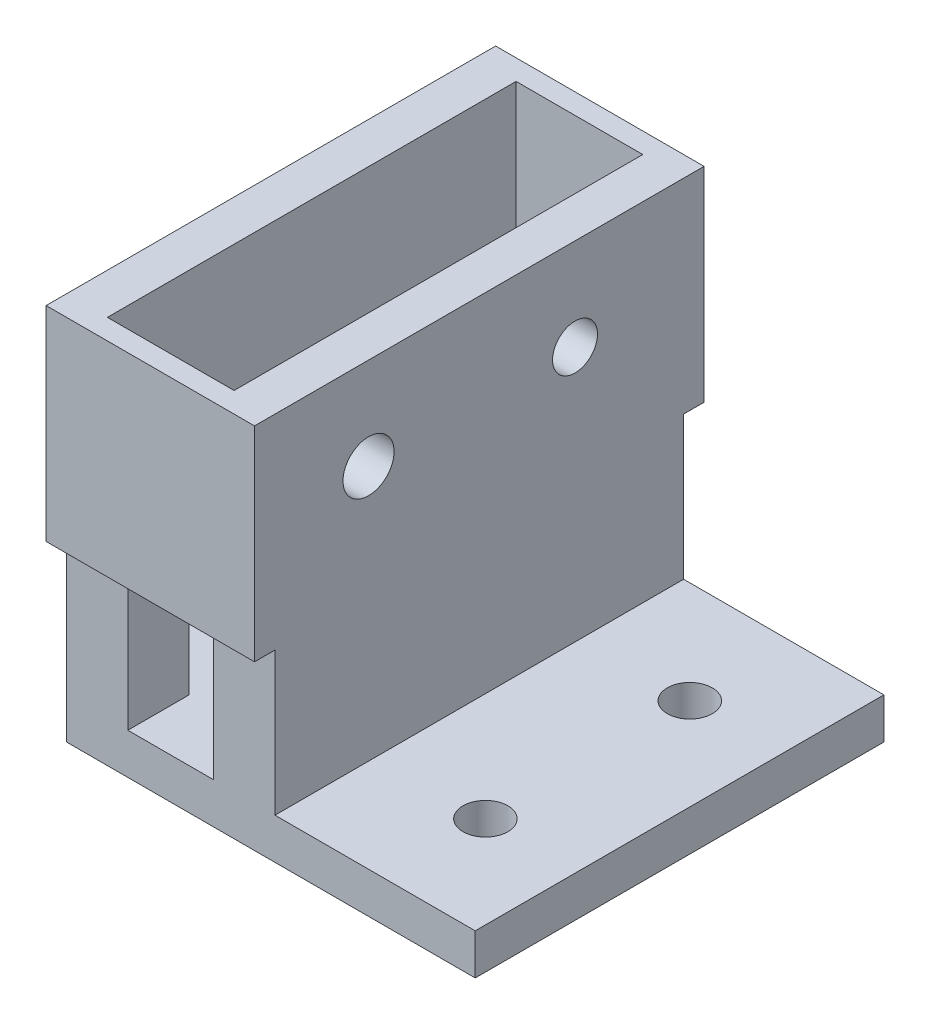
ISO-10303-21;
HEADER;
FILE_DESCRIPTION(('STEP AP214'),'2;1');
FILE_NAME('part.step','',(''),(''),'','','');
FILE_SCHEMA(('AUTOMOTIVE_DESIGN { 1 0 10303 214 1 1 1 1 }'));
ENDSEC;
DATA;
#1=APPLICATION_CONTEXT('core data for automotive mechanical design processes');
#2=APPLICATION_PROTOCOL_DEFINITION('international standard','automotive_design',2000,#1);
#3=PRODUCT_CONTEXT('',#1,'mechanical');
#4=PRODUCT('Part','Part','',(#3));
#5=PRODUCT_RELATED_PRODUCT_CATEGORY('part','',(#4));
#6=PRODUCT_DEFINITION_FORMATION('','',#4);
#7=PRODUCT_DEFINITION_CONTEXT('part definition',#1,'design');
#8=PRODUCT_DEFINITION('design','',#6,#7);
#9=PRODUCT_DEFINITION_SHAPE('','',#8);
#10=(LENGTH_UNIT() NAMED_UNIT(*) SI_UNIT(.MILLI.,.METRE.));
#11=(NAMED_UNIT(*) PLANE_ANGLE_UNIT() SI_UNIT($,.RADIAN.));
#12=(NAMED_UNIT(*) SI_UNIT($,.STERADIAN.) SOLID_ANGLE_UNIT());
#13=UNCERTAINTY_MEASURE_WITH_UNIT(LENGTH_MEASURE(1.E-05),#10,'distance_accuracy_value','');
#14=(GEOMETRIC_REPRESENTATION_CONTEXT(3) GLOBAL_UNCERTAINTY_ASSIGNED_CONTEXT((#13)) GLOBAL_UNIT_ASSIGNED_CONTEXT((#10,
#11,#12)) REPRESENTATION_CONTEXT('',''));
#15=CARTESIAN_POINT('',(0.,0.,0.));
#16=DIRECTION('',(0.,0.,1.));
#17=DIRECTION('',(1.,0.,0.));
#18=AXIS2_PLACEMENT_3D('',#15,#16,#17);
#19=CARTESIAN_POINT('',(0.,0.,0.));
#20=DIRECTION('',(0.,0.,-1.));
#21=DIRECTION('',(-1.,0.,0.));
#22=AXIS2_PLACEMENT_3D('',#19,#20,#21);
#23=PLANE('',#22);
#24=DIRECTION('',(0.,-1.,0.));
#25=VECTOR('',#24,1.);
#26=CARTESIAN_POINT('',(0.,11.,0.));
#27=LINE('',#26,#25);
#28=CARTESIAN_POINT('',(0.,0.999999999999999,0.));
#29=VERTEX_POINT('',#28);
#30=CARTESIAN_POINT('',(0.,-8.,0.));
#31=VERTEX_POINT('',#30);
#32=EDGE_CURVE('E240',#29,#31,#27,.T.);
#33=ORIENTED_EDGE('',*,*,#32,.F.);
#34=DIRECTION('',(1.,0.,0.));
#35=VECTOR('',#34,1.);
#36=CARTESIAN_POINT('',(0.,0.999999999999999,0.));
#37=LINE('',#36,#35);
#38=CARTESIAN_POINT('',(3.,0.999999999999999,0.));
#39=VERTEX_POINT('',#38);
#40=EDGE_CURVE('E319',#29,#39,#37,.T.);
#41=ORIENTED_EDGE('',*,*,#40,.T.);
#42=DIRECTION('',(0.,1.,0.));
#43=VECTOR('',#42,1.);
#44=CARTESIAN_POINT('',(3.,2.,0.));
#45=LINE('',#44,#43);
#46=CARTESIAN_POINT('',(3.,-6.,0.));
#47=VERTEX_POINT('',#46);
#48=EDGE_CURVE('E265',#47,#39,#45,.T.);
#49=ORIENTED_EDGE('',*,*,#48,.F.);
#50=DIRECTION('',(-1.,0.,0.));
#51=VECTOR('',#50,1.);
#52=CARTESIAN_POINT('',(3.,-6.,0.));
#53=LINE('',#52,#51);
#54=CARTESIAN_POINT('',(7.2,-6.,0.));
#55=VERTEX_POINT('',#54);
#56=EDGE_CURVE('E261',#55,#47,#53,.T.);
#57=ORIENTED_EDGE('',*,*,#56,.F.);
#58=DIRECTION('',(0.,-1.,0.));
#59=VECTOR('',#58,1.);
#60=CARTESIAN_POINT('',(7.2,-6.,0.));
#61=LINE('',#60,#59);
#62=CARTESIAN_POINT('',(7.2,0.999999999999999,0.));
#63=VERTEX_POINT('',#62);
#64=EDGE_CURVE('E257',#63,#55,#61,.T.);
#65=ORIENTED_EDGE('',*,*,#64,.F.);
#66=CARTESIAN_POINT('',(10.2,0.999999999999999,0.));
#67=VERTEX_POINT('',#66);
#68=EDGE_CURVE('E43',#63,#67,#37,.T.);
#69=ORIENTED_EDGE('',*,*,#68,.T.);
#70=DIRECTION('',(0.,1.,0.));
#71=VECTOR('',#70,1.);
#72=CARTESIAN_POINT('',(10.2,11.,0.));
#73=LINE('',#72,#71);
#74=CARTESIAN_POINT('',(10.2,-6.,0.));
#75=VERTEX_POINT('',#74);
#76=EDGE_CURVE('E249',#75,#67,#73,.T.);
#77=ORIENTED_EDGE('',*,*,#76,.F.);
#78=DIRECTION('',(-1.,0.,0.));
#79=VECTOR('',#78,1.);
#80=CARTESIAN_POINT('',(10.2,-6.,0.));
#81=LINE('',#80,#79);
#82=CARTESIAN_POINT('',(20.,-6.,0.));
#83=VERTEX_POINT('',#82);
#84=EDGE_CURVE('E247',#83,#75,#81,.T.);
#85=ORIENTED_EDGE('',*,*,#84,.F.);
#86=DIRECTION('',(0.,1.,0.));
#87=VECTOR('',#86,1.);
#88=CARTESIAN_POINT('',(20.,-8.,0.));
#89=LINE('',#88,#87);
#90=CARTESIAN_POINT('',(20.,-8.,0.));
#91=VERTEX_POINT('',#90);
#92=EDGE_CURVE('E245',#91,#83,#89,.T.);
#93=ORIENTED_EDGE('',*,*,#92,.F.);
#94=DIRECTION('',(1.,0.,0.));
#95=VECTOR('',#94,1.);
#96=CARTESIAN_POINT('',(0.,-8.,0.));
#97=LINE('',#96,#95);
#98=EDGE_CURVE('E242',#31,#91,#97,.T.);
#99=ORIENTED_EDGE('',*,*,#98,.F.);
#100=EDGE_LOOP('',(#33,#41,#49,#57,#65,#69,#77,#85,#93,#99));
#101=FACE_BOUND('',#100,.T.);
#102=ADVANCED_FACE('F34',(#101),#23,.T.);
#103=CARTESIAN_POINT('',(0.,11.,20.));
#104=DIRECTION('',(1.,0.,0.));
#105=DIRECTION('',(0.,1.,0.));
#106=AXIS2_PLACEMENT_3D('',#103,#104,#105);
#107=PLANE('',#106);
#108=DIRECTION('',(0.,0.,1.));
#109=VECTOR('',#108,1.);
#110=CARTESIAN_POINT('',(0.,-6.,3.));
#111=LINE('',#110,#109);
#112=CARTESIAN_POINT('',(0.,-6.,3.));
#113=VERTEX_POINT('',#112);
#114=CARTESIAN_POINT('',(0.,-6.,17.));
#115=VERTEX_POINT('',#114);
#116=EDGE_CURVE('E404',#113,#115,#111,.T.);
#117=ORIENTED_EDGE('',*,*,#116,.F.);
#118=DIRECTION('',(0.,-1.,0.));
#119=VECTOR('',#118,1.);
#120=CARTESIAN_POINT('',(0.,-6.,3.));
#121=LINE('',#120,#119);
#122=CARTESIAN_POINT('',(0.,-2.,3.));
#123=VERTEX_POINT('',#122);
#124=EDGE_CURVE('E395',#123,#113,#121,.T.);
#125=ORIENTED_EDGE('',*,*,#124,.F.);
#126=DIRECTION('',(0.,0.,-1.));
#127=VECTOR('',#126,1.);
#128=CARTESIAN_POINT('',(0.,-2.,3.));
#129=LINE('',#128,#127);
#130=CARTESIAN_POINT('',(0.,-2.,17.));
#131=VERTEX_POINT('',#130);
#132=EDGE_CURVE('E410',#131,#123,#129,.T.);
#133=ORIENTED_EDGE('',*,*,#132,.F.);
#134=DIRECTION('',(0.,1.,0.));
#135=VECTOR('',#134,1.);
#136=CARTESIAN_POINT('',(0.,-6.,17.));
#137=LINE('',#136,#135);
#138=EDGE_CURVE('E407',#115,#131,#137,.T.);
#139=ORIENTED_EDGE('',*,*,#138,.F.);
#140=EDGE_LOOP('',(#117,#125,#133,#139));
#141=FACE_BOUND('',#140,.T.);
#142=DIRECTION('',(0.,0.,-1.));
#143=VECTOR('',#142,1.);
#144=CARTESIAN_POINT('',(0.,11.,20.));
#145=LINE('',#144,#143);
#146=CARTESIAN_POINT('',(0.,11.,21.));
#147=VERTEX_POINT('',#146);
#148=CARTESIAN_POINT('',(0.,11.,-1.));
#149=VERTEX_POINT('',#148);
#150=EDGE_CURVE('E38',#147,#149,#145,.T.);
#151=ORIENTED_EDGE('',*,*,#150,.T.);
#152=DIRECTION('',(0.,1.,0.));
#153=VECTOR('',#152,1.);
#154=CARTESIAN_POINT('',(0.,0.999999999999999,-1.));
#155=LINE('',#154,#153);
#156=CARTESIAN_POINT('',(0.,0.999999999999999,-1.));
#157=VERTEX_POINT('',#156);
#158=EDGE_CURVE('E364',#157,#149,#155,.T.);
#159=ORIENTED_EDGE('',*,*,#158,.F.);
#160=DIRECTION('',(0.,0.,1.));
#161=VECTOR('',#160,1.);
#162=CARTESIAN_POINT('',(0.,0.999999999999999,-1.));
#163=LINE('',#162,#161);
#164=EDGE_CURVE('E329',#157,#29,#163,.T.);
#165=ORIENTED_EDGE('',*,*,#164,.T.);
#166=ORIENTED_EDGE('',*,*,#32,.T.);
#167=DIRECTION('',(0.,0.,-1.));
#168=VECTOR('',#167,1.);
#169=CARTESIAN_POINT('',(0.,-8.,20.));
#170=LINE('',#169,#168);
#171=CARTESIAN_POINT('',(0.,-8.,20.));
#172=VERTEX_POINT('',#171);
#173=EDGE_CURVE('E308',#172,#31,#170,.T.);
#174=ORIENTED_EDGE('',*,*,#173,.F.);
#175=DIRECTION('',(0.,-1.,0.));
#176=VECTOR('',#175,1.);
#177=CARTESIAN_POINT('',(0.,11.,20.));
#178=LINE('',#177,#176);
#179=CARTESIAN_POINT('',(0.,0.999999999999999,20.));
#180=VERTEX_POINT('',#179);
#181=EDGE_CURVE('E274',#180,#172,#178,.T.);
#182=ORIENTED_EDGE('',*,*,#181,.F.);
#183=DIRECTION('',(0.,0.,1.));
#184=VECTOR('',#183,1.);
#185=CARTESIAN_POINT('',(0.,0.999999999999999,20.));
#186=LINE('',#185,#184);
#187=CARTESIAN_POINT('',(0.,0.999999999999999,21.));
#188=VERTEX_POINT('',#187);
#189=EDGE_CURVE('E58',#180,#188,#186,.T.);
#190=ORIENTED_EDGE('',*,*,#189,.T.);
#191=DIRECTION('',(0.,1.,0.));
#192=VECTOR('',#191,1.);
#193=CARTESIAN_POINT('',(0.,0.999999999999999,21.));
#194=LINE('',#193,#192);
#195=EDGE_CURVE('E340',#188,#147,#194,.T.);
#196=ORIENTED_EDGE('',*,*,#195,.T.);
#197=EDGE_LOOP('',(#151,#159,#165,#166,#174,#182,#190,#196));
#198=FACE_BOUND('',#197,.T.);
#199=ADVANCED_FACE('F36',(#141,#198),#107,.F.);
#200=CARTESIAN_POINT('',(0.,-8.,20.));
#201=DIRECTION('',(0.,1.,0.));
#202=DIRECTION('',(0.,0.,1.));
#203=AXIS2_PLACEMENT_3D('',#200,#201,#202);
#204=PLANE('',#203);
#205=CARTESIAN_POINT('',(15.5,-8.,15.));
#206=DIRECTION('',(0.,1.,0.));
#207=DIRECTION('',(0.,0.,1.));
#208=AXIS2_PLACEMENT_3D('',#205,#206,#207);
#209=CIRCLE('',#208,1.1);
#210=CARTESIAN_POINT('',(15.5,-8.,16.1));
#211=VERTEX_POINT('',#210);
#212=EDGE_CURVE('E386',#211,#211,#209,.T.);
#213=ORIENTED_EDGE('',*,*,#212,.T.);
#214=EDGE_LOOP('',(#213));
#215=FACE_BOUND('',#214,.T.);
#216=CARTESIAN_POINT('',(15.5,-8.,5.));
#217=DIRECTION('',(0.,1.,0.));
#218=DIRECTION('',(0.,0.,1.));
#219=AXIS2_PLACEMENT_3D('',#216,#217,#218);
#220=CIRCLE('',#219,1.1);
#221=CARTESIAN_POINT('',(15.5,-8.,6.1));
#222=VERTEX_POINT('',#221);
#223=EDGE_CURVE('E392',#222,#222,#220,.T.);
#224=ORIENTED_EDGE('',*,*,#223,.T.);
#225=EDGE_LOOP('',(#224));
#226=FACE_BOUND('',#225,.T.);
#227=ORIENTED_EDGE('',*,*,#98,.T.);
#228=DIRECTION('',(0.,0.,-1.));
#229=VECTOR('',#228,1.);
#230=CARTESIAN_POINT('',(20.,-8.,20.));
#231=LINE('',#230,#229);
#232=CARTESIAN_POINT('',(20.,-8.,20.));
#233=VERTEX_POINT('',#232);
#234=EDGE_CURVE('E306',#233,#91,#231,.T.);
#235=ORIENTED_EDGE('',*,*,#234,.F.);
#236=DIRECTION('',(1.,0.,0.));
#237=VECTOR('',#236,1.);
#238=CARTESIAN_POINT('',(0.,-8.,20.));
#239=LINE('',#238,#237);
#240=EDGE_CURVE('E422',#172,#233,#239,.T.);
#241=ORIENTED_EDGE('',*,*,#240,.F.);
#242=ORIENTED_EDGE('',*,*,#173,.T.);
#243=EDGE_LOOP('',(#227,#235,#241,#242));
#244=FACE_BOUND('',#243,.T.);
#245=ADVANCED_FACE('F432',(#215,#226,#244),#204,.F.);
#246=CARTESIAN_POINT('',(20.,-8.,20.));
#247=DIRECTION('',(-1.,0.,0.));
#248=DIRECTION('',(0.,0.,1.));
#249=AXIS2_PLACEMENT_3D('',#246,#247,#248);
#250=PLANE('',#249);
#251=ORIENTED_EDGE('',*,*,#92,.T.);
#252=DIRECTION('',(0.,0.,-1.));
#253=VECTOR('',#252,1.);
#254=CARTESIAN_POINT('',(20.,-6.,20.));
#255=LINE('',#254,#253);
#256=CARTESIAN_POINT('',(20.,-6.,20.));
#257=VERTEX_POINT('',#256);
#258=EDGE_CURVE('E303',#257,#83,#255,.T.);
#259=ORIENTED_EDGE('',*,*,#258,.F.);
#260=DIRECTION('',(0.,1.,0.));
#261=VECTOR('',#260,1.);
#262=CARTESIAN_POINT('',(20.,-8.,20.));
#263=LINE('',#262,#261);
#264=EDGE_CURVE('E221',#233,#257,#263,.T.);
#265=ORIENTED_EDGE('',*,*,#264,.F.);
#266=ORIENTED_EDGE('',*,*,#234,.T.);
#267=EDGE_LOOP('',(#251,#259,#265,#266));
#268=FACE_BOUND('',#267,.T.);
#269=ADVANCED_FACE('F427',(#268),#250,.F.);
#270=CARTESIAN_POINT('',(10.2,-6.,20.));
#271=DIRECTION('',(0.,-1.,0.));
#272=DIRECTION('',(0.,0.,-1.));
#273=AXIS2_PLACEMENT_3D('',#270,#271,#272);
#274=PLANE('',#273);
#275=CARTESIAN_POINT('',(15.5,-6.,15.));
#276=DIRECTION('',(0.,1.,0.));
#277=DIRECTION('',(0.,0.,1.));
#278=AXIS2_PLACEMENT_3D('',#275,#276,#277);
#279=CIRCLE('',#278,1.1);
#280=CARTESIAN_POINT('',(15.5,-6.,16.1));
#281=VERTEX_POINT('',#280);
#282=EDGE_CURVE('E383',#281,#281,#279,.T.);
#283=ORIENTED_EDGE('',*,*,#282,.F.);
#284=EDGE_LOOP('',(#283));
#285=FACE_BOUND('',#284,.T.);
#286=CARTESIAN_POINT('',(15.5,-6.,5.));
#287=DIRECTION('',(0.,1.,0.));
#288=DIRECTION('',(0.,0.,1.));
#289=AXIS2_PLACEMENT_3D('',#286,#287,#288);
#290=CIRCLE('',#289,1.1);
#291=CARTESIAN_POINT('',(15.5,-6.,6.1));
#292=VERTEX_POINT('',#291);
#293=EDGE_CURVE('E389',#292,#292,#290,.T.);
#294=ORIENTED_EDGE('',*,*,#293,.F.);
#295=EDGE_LOOP('',(#294));
#296=FACE_BOUND('',#295,.T.);
#297=ORIENTED_EDGE('',*,*,#84,.T.);
#298=DIRECTION('',(0.,0.,-1.));
#299=VECTOR('',#298,1.);
#300=CARTESIAN_POINT('',(10.2,-6.,20.));
#301=LINE('',#300,#299);
#302=CARTESIAN_POINT('',(10.2,-6.,20.));
#303=VERTEX_POINT('',#302);
#304=EDGE_CURVE('E301',#303,#75,#301,.T.);
#305=ORIENTED_EDGE('',*,*,#304,.F.);
#306=DIRECTION('',(-1.,0.,0.));
#307=VECTOR('',#306,1.);
#308=CARTESIAN_POINT('',(10.2,-6.,20.));
#309=LINE('',#308,#307);
#310=EDGE_CURVE('E215',#257,#303,#309,.T.);
#311=ORIENTED_EDGE('',*,*,#310,.F.);
#312=ORIENTED_EDGE('',*,*,#258,.T.);
#313=EDGE_LOOP('',(#297,#305,#311,#312));
#314=FACE_BOUND('',#313,.T.);
#315=ADVANCED_FACE('F431',(#285,#296,#314),#274,.F.);
#316=CARTESIAN_POINT('',(10.2,11.,20.));
#317=DIRECTION('',(-1.,0.,0.));
#318=DIRECTION('',(0.,-1.,0.));
#319=AXIS2_PLACEMENT_3D('',#316,#317,#318);
#320=PLANE('',#319);
#321=CARTESIAN_POINT('',(10.2,6.5,5.31577710767275));
#322=DIRECTION('',(1.,0.,0.));
#323=DIRECTION('',(0.,0.,-1.));
#324=AXIS2_PLACEMENT_3D('',#321,#322,#323);
#325=CIRCLE('',#324,1.1);
#326=CARTESIAN_POINT('',(10.2,6.5,4.21577710767275));
#327=VERTEX_POINT('',#326);
#328=EDGE_CURVE('E367',#327,#327,#325,.T.);
#329=ORIENTED_EDGE('',*,*,#328,.F.);
#330=EDGE_LOOP('',(#329));
#331=FACE_BOUND('',#330,.T.);
#332=CARTESIAN_POINT('',(10.2,6.5,15.4211545187749));
#333=DIRECTION('',(1.,0.,0.));
#334=DIRECTION('',(0.,0.,-1.));
#335=AXIS2_PLACEMENT_3D('',#332,#333,#334);
#336=CIRCLE('',#335,1.25);
#337=CARTESIAN_POINT('',(10.2,6.5,14.1711545187749));
#338=VERTEX_POINT('',#337);
#339=EDGE_CURVE('E377',#338,#338,#336,.T.);
#340=ORIENTED_EDGE('',*,*,#339,.F.);
#341=EDGE_LOOP('',(#340));
#342=FACE_BOUND('',#341,.T.);
#343=ORIENTED_EDGE('',*,*,#76,.T.);
#344=DIRECTION('',(0.,0.,-1.));
#345=VECTOR('',#344,1.);
#346=CARTESIAN_POINT('',(10.2,0.999999999999999,0.));
#347=LINE('',#346,#345);
#348=CARTESIAN_POINT('',(10.2,0.999999999999999,-1.));
#349=VERTEX_POINT('',#348);
#350=EDGE_CURVE('E327',#67,#349,#347,.T.);
#351=ORIENTED_EDGE('',*,*,#350,.T.);
#352=DIRECTION('',(0.,1.,0.));
#353=VECTOR('',#352,1.);
#354=CARTESIAN_POINT('',(10.2,0.999999999999999,-1.));
#355=LINE('',#354,#353);
#356=CARTESIAN_POINT('',(10.2,11.,-1.));
#357=VERTEX_POINT('',#356);
#358=EDGE_CURVE('E362',#349,#357,#355,.T.);
#359=ORIENTED_EDGE('',*,*,#358,.T.);
#360=DIRECTION('',(0.,0.,-1.));
#361=VECTOR('',#360,1.);
#362=CARTESIAN_POINT('',(10.2,11.,20.));
#363=LINE('',#362,#361);
#364=CARTESIAN_POINT('',(10.2,11.,21.));
#365=VERTEX_POINT('',#364);
#366=EDGE_CURVE('E299',#365,#357,#363,.T.);
#367=ORIENTED_EDGE('',*,*,#366,.F.);
#368=DIRECTION('',(0.,1.,0.));
#369=VECTOR('',#368,1.);
#370=CARTESIAN_POINT('',(10.2,0.999999999999999,21.));
#371=LINE('',#370,#369);
#372=CARTESIAN_POINT('',(10.2,0.999999999999999,21.));
#373=VERTEX_POINT('',#372);
#374=EDGE_CURVE('E210',#373,#365,#371,.T.);
#375=ORIENTED_EDGE('',*,*,#374,.F.);
#376=DIRECTION('',(0.,0.,-1.));
#377=VECTOR('',#376,1.);
#378=CARTESIAN_POINT('',(10.2,0.999999999999999,21.));
#379=LINE('',#378,#377);
#380=CARTESIAN_POINT('',(10.2,0.999999999999999,20.));
#381=VERTEX_POINT('',#380);
#382=EDGE_CURVE('E198',#373,#381,#379,.T.);
#383=ORIENTED_EDGE('',*,*,#382,.T.);
#384=DIRECTION('',(0.,1.,0.));
#385=VECTOR('',#384,1.);
#386=CARTESIAN_POINT('',(10.2,11.,20.));
#387=LINE('',#386,#385);
#388=EDGE_CURVE('E208',#303,#381,#387,.T.);
#389=ORIENTED_EDGE('',*,*,#388,.F.);
#390=ORIENTED_EDGE('',*,*,#304,.T.);
#391=EDGE_LOOP('',(#343,#351,#359,#367,#375,#383,#389,#390));
#392=FACE_BOUND('',#391,.T.);
#393=ADVANCED_FACE('F206',(#331,#342,#392),#320,.F.);
#394=CARTESIAN_POINT('',(8.2,11.,20.));
#395=DIRECTION('',(0.,-1.,0.));
#396=DIRECTION('',(0.,0.,-1.));
#397=AXIS2_PLACEMENT_3D('',#394,#395,#396);
#398=PLANE('',#397);
#399=ORIENTED_EDGE('',*,*,#150,.F.);
#400=DIRECTION('',(1.,0.,0.));
#401=VECTOR('',#400,1.);
#402=CARTESIAN_POINT('',(0.,11.,21.));
#403=LINE('',#402,#401);
#404=EDGE_CURVE('E211',#147,#365,#403,.T.);
#405=ORIENTED_EDGE('',*,*,#404,.T.);
#406=ORIENTED_EDGE('',*,*,#366,.T.);
#407=DIRECTION('',(-1.,0.,0.));
#408=VECTOR('',#407,1.);
#409=CARTESIAN_POINT('',(10.2,11.,-1.));
#410=LINE('',#409,#408);
#411=EDGE_CURVE('E333',#357,#149,#410,.T.);
#412=ORIENTED_EDGE('',*,*,#411,.T.);
#413=EDGE_LOOP('',(#399,#405,#406,#412));
#414=FACE_BOUND('',#413,.T.);
#415=DIRECTION('',(-1.,0.,0.));
#416=VECTOR('',#415,1.);
#417=CARTESIAN_POINT('',(10.2,11.,20.));
#418=LINE('',#417,#416);
#419=CARTESIAN_POINT('',(8.2,11.,20.));
#420=VERTEX_POINT('',#419);
#421=CARTESIAN_POINT('',(2.,11.,20.));
#422=VERTEX_POINT('',#421);
#423=EDGE_CURVE('E346',#420,#422,#418,.T.);
#424=ORIENTED_EDGE('',*,*,#423,.T.);
#425=DIRECTION('',(0.,0.,-1.));
#426=VECTOR('',#425,1.);
#427=CARTESIAN_POINT('',(2.,11.,20.));
#428=LINE('',#427,#426);
#429=CARTESIAN_POINT('',(2.,11.,0.));
#430=VERTEX_POINT('',#429);
#431=EDGE_CURVE('E239',#422,#430,#428,.T.);
#432=ORIENTED_EDGE('',*,*,#431,.T.);
#433=DIRECTION('',(1.,0.,0.));
#434=VECTOR('',#433,1.);
#435=CARTESIAN_POINT('',(0.,11.,0.));
#436=LINE('',#435,#434);
#437=CARTESIAN_POINT('',(8.2,11.,0.));
#438=VERTEX_POINT('',#437);
#439=EDGE_CURVE('E337',#430,#438,#436,.T.);
#440=ORIENTED_EDGE('',*,*,#439,.T.);
#441=DIRECTION('',(0.,0.,-1.));
#442=VECTOR('',#441,1.);
#443=CARTESIAN_POINT('',(8.2,11.,20.));
#444=LINE('',#443,#442);
#445=EDGE_CURVE('E296',#420,#438,#444,.T.);
#446=ORIENTED_EDGE('',*,*,#445,.F.);
#447=EDGE_LOOP('',(#424,#432,#440,#446));
#448=FACE_BOUND('',#447,.T.);
#449=ADVANCED_FACE('F355',(#414,#448),#398,.F.);
#450=CARTESIAN_POINT('',(8.2,2.,20.));
#451=DIRECTION('',(1.,0.,0.));
#452=DIRECTION('',(0.,0.,-1.));
#453=AXIS2_PLACEMENT_3D('',#450,#451,#452);
#454=PLANE('',#453);
#455=CARTESIAN_POINT('',(8.2,6.5,5.31577710767275));
#456=DIRECTION('',(1.,0.,0.));
#457=DIRECTION('',(0.,0.,-1.));
#458=AXIS2_PLACEMENT_3D('',#455,#456,#457);
#459=CIRCLE('',#458,1.1);
#460=CARTESIAN_POINT('',(8.2,6.5,4.21577710767275));
#461=VERTEX_POINT('',#460);
#462=EDGE_CURVE('E370',#461,#461,#459,.F.);
#463=ORIENTED_EDGE('',*,*,#462,.F.);
#464=EDGE_LOOP('',(#463));
#465=FACE_BOUND('',#464,.T.);
#466=CARTESIAN_POINT('',(8.2,6.5,15.4211545187749));
#467=DIRECTION('',(1.,0.,0.));
#468=DIRECTION('',(0.,0.,-1.));
#469=AXIS2_PLACEMENT_3D('',#466,#467,#468);
#470=CIRCLE('',#469,1.25);
#471=CARTESIAN_POINT('',(8.2,6.5,14.1711545187749));
#472=VERTEX_POINT('',#471);
#473=EDGE_CURVE('E380',#472,#472,#470,.F.);
#474=ORIENTED_EDGE('',*,*,#473,.F.);
#475=EDGE_LOOP('',(#474));
#476=FACE_BOUND('',#475,.T.);
#477=DIRECTION('',(0.,-1.,0.));
#478=VECTOR('',#477,1.);
#479=CARTESIAN_POINT('',(8.2,2.,0.));
#480=LINE('',#479,#478);
#481=CARTESIAN_POINT('',(8.2,2.,0.));
#482=VERTEX_POINT('',#481);
#483=EDGE_CURVE('E251',#438,#482,#480,.T.);
#484=ORIENTED_EDGE('',*,*,#483,.T.);
#485=DIRECTION('',(0.,0.,-1.));
#486=VECTOR('',#485,1.);
#487=CARTESIAN_POINT('',(8.2,2.,20.));
#488=LINE('',#487,#486);
#489=CARTESIAN_POINT('',(8.2,2.,20.));
#490=VERTEX_POINT('',#489);
#491=EDGE_CURVE('E293',#490,#482,#488,.T.);
#492=ORIENTED_EDGE('',*,*,#491,.F.);
#493=DIRECTION('',(0.,-1.,0.));
#494=VECTOR('',#493,1.);
#495=CARTESIAN_POINT('',(8.2,2.,20.));
#496=LINE('',#495,#494);
#497=EDGE_CURVE('E217',#420,#490,#496,.T.);
#498=ORIENTED_EDGE('',*,*,#497,.F.);
#499=ORIENTED_EDGE('',*,*,#445,.T.);
#500=EDGE_LOOP('',(#484,#492,#498,#499));
#501=FACE_BOUND('',#500,.T.);
#502=ADVANCED_FACE('F472',(#465,#476,#501),#454,.F.);
#503=CARTESIAN_POINT('',(7.2,2.,20.));
#504=DIRECTION('',(0.,-1.,0.));
#505=DIRECTION('',(0.,0.,-1.));
#506=AXIS2_PLACEMENT_3D('',#503,#504,#505);
#507=PLANE('',#506);
#508=DIRECTION('',(-1.,0.,0.));
#509=VECTOR('',#508,1.);
#510=CARTESIAN_POINT('',(7.2,2.,0.));
#511=LINE('',#510,#509);
#512=CARTESIAN_POINT('',(7.2,2.,0.));
#513=VERTEX_POINT('',#512);
#514=EDGE_CURVE('E254',#482,#513,#511,.T.);
#515=ORIENTED_EDGE('',*,*,#514,.T.);
#516=DIRECTION('',(0.,0.,-1.));
#517=VECTOR('',#516,1.);
#518=CARTESIAN_POINT('',(7.2,2.,20.));
#519=LINE('',#518,#517);
#520=CARTESIAN_POINT('',(7.2,2.,20.));
#521=VERTEX_POINT('',#520);
#522=EDGE_CURVE('E290',#521,#513,#519,.T.);
#523=ORIENTED_EDGE('',*,*,#522,.F.);
#524=DIRECTION('',(-1.,0.,0.));
#525=VECTOR('',#524,1.);
#526=CARTESIAN_POINT('',(7.2,2.,20.));
#527=LINE('',#526,#525);
#528=EDGE_CURVE('E219',#490,#521,#527,.T.);
#529=ORIENTED_EDGE('',*,*,#528,.F.);
#530=ORIENTED_EDGE('',*,*,#491,.T.);
#531=EDGE_LOOP('',(#515,#523,#529,#530));
#532=FACE_BOUND('',#531,.T.);
#533=ADVANCED_FACE('F468',(#532),#507,.F.);
#534=CARTESIAN_POINT('',(7.2,-6.,20.));
#535=DIRECTION('',(1.,0.,0.));
#536=DIRECTION('',(0.,0.,-1.));
#537=AXIS2_PLACEMENT_3D('',#534,#535,#536);
#538=PLANE('',#537);
#539=EDGE_CURVE('E258',#513,#63,#61,.T.);
#540=ORIENTED_EDGE('',*,*,#539,.T.);
#541=ORIENTED_EDGE('',*,*,#64,.T.);
#542=DIRECTION('',(0.,0.,-1.));
#543=VECTOR('',#542,1.);
#544=CARTESIAN_POINT('',(7.2,-6.,20.));
#545=LINE('',#544,#543);
#546=CARTESIAN_POINT('',(7.2,-6.,20.));
#547=VERTEX_POINT('',#546);
#548=EDGE_CURVE('E287',#547,#55,#545,.T.);
#549=ORIENTED_EDGE('',*,*,#548,.F.);
#550=DIRECTION('',(0.,-1.,0.));
#551=VECTOR('',#550,1.);
#552=CARTESIAN_POINT('',(7.2,-6.,20.));
#553=LINE('',#552,#551);
#554=CARTESIAN_POINT('',(7.2,0.999999999999999,20.));
#555=VERTEX_POINT('',#554);
#556=EDGE_CURVE('E226',#555,#547,#553,.T.);
#557=ORIENTED_EDGE('',*,*,#556,.F.);
#558=EDGE_CURVE('E227',#521,#555,#553,.T.);
#559=ORIENTED_EDGE('',*,*,#558,.F.);
#560=ORIENTED_EDGE('',*,*,#522,.T.);
#561=EDGE_LOOP('',(#540,#541,#549,#557,#559,#560));
#562=FACE_BOUND('',#561,.T.);
#563=ADVANCED_FACE('F464',(#562),#538,.F.);
#564=CARTESIAN_POINT('',(3.,-6.,20.));
#565=DIRECTION('',(0.,-1.,0.));
#566=DIRECTION('',(0.,0.,-1.));
#567=AXIS2_PLACEMENT_3D('',#564,#565,#566);
#568=PLANE('',#567);
#569=ORIENTED_EDGE('',*,*,#56,.T.);
#570=DIRECTION('',(0.,0.,-1.));
#571=VECTOR('',#570,1.);
#572=CARTESIAN_POINT('',(3.,-6.,20.));
#573=LINE('',#572,#571);
#574=CARTESIAN_POINT('',(3.,-6.,3.));
#575=VERTEX_POINT('',#574);
#576=EDGE_CURVE('E283',#575,#47,#573,.T.);
#577=ORIENTED_EDGE('',*,*,#576,.F.);
#578=DIRECTION('',(-1.,0.,0.));
#579=VECTOR('',#578,1.);
#580=CARTESIAN_POINT('',(17.560219778561,-6.,3.));
#581=LINE('',#580,#579);
#582=EDGE_CURVE('E413',#575,#113,#581,.T.);
#583=ORIENTED_EDGE('',*,*,#582,.T.);
#584=ORIENTED_EDGE('',*,*,#116,.T.);
#585=DIRECTION('',(-1.,0.,0.));
#586=VECTOR('',#585,1.);
#587=CARTESIAN_POINT('',(17.560219778561,-6.,17.));
#588=LINE('',#587,#586);
#589=CARTESIAN_POINT('',(3.,-6.,17.));
#590=VERTEX_POINT('',#589);
#591=EDGE_CURVE('E417',#590,#115,#588,.T.);
#592=ORIENTED_EDGE('',*,*,#591,.F.);
#593=CARTESIAN_POINT('',(3.,-6.,20.));
#594=VERTEX_POINT('',#593);
#595=EDGE_CURVE('E284',#594,#590,#573,.T.);
#596=ORIENTED_EDGE('',*,*,#595,.F.);
#597=DIRECTION('',(-1.,0.,0.));
#598=VECTOR('',#597,1.);
#599=CARTESIAN_POINT('',(3.,-6.,20.));
#600=LINE('',#599,#598);
#601=EDGE_CURVE('E229',#547,#594,#600,.T.);
#602=ORIENTED_EDGE('',*,*,#601,.F.);
#603=ORIENTED_EDGE('',*,*,#548,.T.);
#604=EDGE_LOOP('',(#569,#577,#583,#584,#592,#596,#602,#603));
#605=FACE_BOUND('',#604,.T.);
#606=ADVANCED_FACE('F460',(#605),#568,.F.);
#607=CARTESIAN_POINT('',(3.,2.,20.));
#608=DIRECTION('',(-1.,0.,0.));
#609=DIRECTION('',(0.,0.,1.));
#610=AXIS2_PLACEMENT_3D('',#607,#608,#609);
#611=PLANE('',#610);
#612=DIRECTION('',(0.,0.,1.));
#613=VECTOR('',#612,1.);
#614=CARTESIAN_POINT('',(3.,-2.,3.));
#615=LINE('',#614,#613);
#616=CARTESIAN_POINT('',(3.,-2.,3.));
#617=VERTEX_POINT('',#616);
#618=CARTESIAN_POINT('',(3.,-2.,17.));
#619=VERTEX_POINT('',#618);
#620=EDGE_CURVE('E399',#617,#619,#615,.T.);
#621=ORIENTED_EDGE('',*,*,#620,.F.);
#622=DIRECTION('',(0.,1.,0.));
#623=VECTOR('',#622,1.);
#624=CARTESIAN_POINT('',(3.,-6.,3.));
#625=LINE('',#624,#623);
#626=EDGE_CURVE('E243',#575,#617,#625,.T.);
#627=ORIENTED_EDGE('',*,*,#626,.F.);
#628=ORIENTED_EDGE('',*,*,#576,.T.);
#629=ORIENTED_EDGE('',*,*,#48,.T.);
#630=CARTESIAN_POINT('',(3.,2.,0.));
#631=VERTEX_POINT('',#630);
#632=EDGE_CURVE('E264',#39,#631,#45,.T.);
#633=ORIENTED_EDGE('',*,*,#632,.T.);
#634=DIRECTION('',(0.,0.,-1.));
#635=VECTOR('',#634,1.);
#636=CARTESIAN_POINT('',(3.,2.,20.));
#637=LINE('',#636,#635);
#638=CARTESIAN_POINT('',(3.,2.,20.));
#639=VERTEX_POINT('',#638);
#640=EDGE_CURVE('E280',#639,#631,#637,.T.);
#641=ORIENTED_EDGE('',*,*,#640,.F.);
#642=DIRECTION('',(0.,1.,0.));
#643=VECTOR('',#642,1.);
#644=CARTESIAN_POINT('',(3.,2.,20.));
#645=LINE('',#644,#643);
#646=CARTESIAN_POINT('',(3.,0.999999999999999,20.));
#647=VERTEX_POINT('',#646);
#648=EDGE_CURVE('E231',#647,#639,#645,.T.);
#649=ORIENTED_EDGE('',*,*,#648,.F.);
#650=EDGE_CURVE('E232',#594,#647,#645,.T.);
#651=ORIENTED_EDGE('',*,*,#650,.F.);
#652=ORIENTED_EDGE('',*,*,#595,.T.);
#653=DIRECTION('',(0.,-1.,0.));
#654=VECTOR('',#653,1.);
#655=CARTESIAN_POINT('',(3.,-6.,17.));
#656=LINE('',#655,#654);
#657=EDGE_CURVE('E396',#619,#590,#656,.T.);
#658=ORIENTED_EDGE('',*,*,#657,.F.);
#659=EDGE_LOOP('',(#621,#627,#628,#629,#633,#641,#649,#651,#652,#658));
#660=FACE_BOUND('',#659,.T.);
#661=ADVANCED_FACE('F456',(#660),#611,.F.);
#662=CARTESIAN_POINT('',(2.,2.,20.));
#663=DIRECTION('',(0.,-1.,0.));
#664=DIRECTION('',(0.,0.,-1.));
#665=AXIS2_PLACEMENT_3D('',#662,#663,#664);
#666=PLANE('',#665);
#667=DIRECTION('',(-1.,0.,0.));
#668=VECTOR('',#667,1.);
#669=CARTESIAN_POINT('',(2.,2.,0.));
#670=LINE('',#669,#668);
#671=CARTESIAN_POINT('',(2.,2.,0.));
#672=VERTEX_POINT('',#671);
#673=EDGE_CURVE('E268',#631,#672,#670,.T.);
#674=ORIENTED_EDGE('',*,*,#673,.T.);
#675=DIRECTION('',(0.,0.,-1.));
#676=VECTOR('',#675,1.);
#677=CARTESIAN_POINT('',(2.,2.,20.));
#678=LINE('',#677,#676);
#679=CARTESIAN_POINT('',(2.,2.,20.));
#680=VERTEX_POINT('',#679);
#681=EDGE_CURVE('E277',#680,#672,#678,.T.);
#682=ORIENTED_EDGE('',*,*,#681,.F.);
#683=DIRECTION('',(-1.,0.,0.));
#684=VECTOR('',#683,1.);
#685=CARTESIAN_POINT('',(2.,2.,20.));
#686=LINE('',#685,#684);
#687=EDGE_CURVE('E235',#639,#680,#686,.T.);
#688=ORIENTED_EDGE('',*,*,#687,.F.);
#689=ORIENTED_EDGE('',*,*,#640,.T.);
#690=EDGE_LOOP('',(#674,#682,#688,#689));
#691=FACE_BOUND('',#690,.T.);
#692=ADVANCED_FACE('F452',(#691),#666,.F.);
#693=CARTESIAN_POINT('',(2.,11.,20.));
#694=DIRECTION('',(-1.,0.,0.));
#695=DIRECTION('',(0.,-1.,0.));
#696=AXIS2_PLACEMENT_3D('',#693,#694,#695);
#697=PLANE('',#696);
#698=DIRECTION('',(0.,1.,0.));
#699=VECTOR('',#698,1.);
#700=CARTESIAN_POINT('',(2.,11.,0.));
#701=LINE('',#700,#699);
#702=EDGE_CURVE('E271',#672,#430,#701,.T.);
#703=ORIENTED_EDGE('',*,*,#702,.T.);
#704=ORIENTED_EDGE('',*,*,#431,.F.);
#705=DIRECTION('',(0.,1.,0.));
#706=VECTOR('',#705,1.);
#707=CARTESIAN_POINT('',(2.,11.,20.));
#708=LINE('',#707,#706);
#709=EDGE_CURVE('E237',#680,#422,#708,.T.);
#710=ORIENTED_EDGE('',*,*,#709,.F.);
#711=ORIENTED_EDGE('',*,*,#681,.T.);
#712=EDGE_LOOP('',(#703,#704,#710,#711));
#713=FACE_BOUND('',#712,.T.);
#714=ADVANCED_FACE('F449',(#713),#697,.F.);
#715=CARTESIAN_POINT('',(0.,0.,20.));
#716=DIRECTION('',(0.,0.,-1.));
#717=DIRECTION('',(-1.,0.,0.));
#718=AXIS2_PLACEMENT_3D('',#715,#716,#717);
#719=PLANE('',#718);
#720=ORIENTED_EDGE('',*,*,#388,.T.);
#721=DIRECTION('',(-1.,0.,0.));
#722=VECTOR('',#721,1.);
#723=CARTESIAN_POINT('',(10.2,0.999999999999999,20.));
#724=LINE('',#723,#722);
#725=EDGE_CURVE('E45',#381,#555,#724,.T.);
#726=ORIENTED_EDGE('',*,*,#725,.T.);
#727=ORIENTED_EDGE('',*,*,#556,.T.);
#728=ORIENTED_EDGE('',*,*,#601,.T.);
#729=ORIENTED_EDGE('',*,*,#650,.T.);
#730=EDGE_CURVE('E11',#647,#180,#724,.T.);
#731=ORIENTED_EDGE('',*,*,#730,.T.);
#732=ORIENTED_EDGE('',*,*,#181,.T.);
#733=ORIENTED_EDGE('',*,*,#240,.T.);
#734=ORIENTED_EDGE('',*,*,#264,.T.);
#735=ORIENTED_EDGE('',*,*,#310,.T.);
#736=EDGE_LOOP('',(#720,#726,#727,#728,#729,#731,#732,#733,#734,#735));
#737=FACE_BOUND('',#736,.T.);
#738=ADVANCED_FACE('F213',(#737),#719,.F.);
#739=CARTESIAN_POINT('',(17.560219778561,-6.,3.));
#740=DIRECTION('',(0.,0.,-1.));
#741=DIRECTION('',(-1.,0.,0.));
#742=AXIS2_PLACEMENT_3D('',#739,#740,#741);
#743=PLANE('',#742);
#744=ORIENTED_EDGE('',*,*,#626,.T.);
#745=DIRECTION('',(-1.,0.,0.));
#746=VECTOR('',#745,1.);
#747=CARTESIAN_POINT('',(17.560219778561,-2.,3.));
#748=LINE('',#747,#746);
#749=EDGE_CURVE('E400',#617,#123,#748,.T.);
#750=ORIENTED_EDGE('',*,*,#749,.T.);
#751=ORIENTED_EDGE('',*,*,#124,.T.);
#752=ORIENTED_EDGE('',*,*,#582,.F.);
#753=EDGE_LOOP('',(#744,#750,#751,#752));
#754=FACE_BOUND('',#753,.T.);
#755=ADVANCED_FACE('F510',(#754),#743,.F.);
#756=CARTESIAN_POINT('',(17.560219778561,-2.,3.));
#757=DIRECTION('',(0.,1.,0.));
#758=DIRECTION('',(0.,0.,1.));
#759=AXIS2_PLACEMENT_3D('',#756,#757,#758);
#760=PLANE('',#759);
#761=ORIENTED_EDGE('',*,*,#620,.T.);
#762=DIRECTION('',(-1.,0.,0.));
#763=VECTOR('',#762,1.);
#764=CARTESIAN_POINT('',(17.560219778561,-2.,17.));
#765=LINE('',#764,#763);
#766=EDGE_CURVE('E415',#619,#131,#765,.T.);
#767=ORIENTED_EDGE('',*,*,#766,.T.);
#768=ORIENTED_EDGE('',*,*,#132,.T.);
#769=ORIENTED_EDGE('',*,*,#749,.F.);
#770=EDGE_LOOP('',(#761,#767,#768,#769));
#771=FACE_BOUND('',#770,.T.);
#772=ADVANCED_FACE('F504',(#771),#760,.F.);
#773=CARTESIAN_POINT('',(17.560219778561,-6.,17.));
#774=DIRECTION('',(0.,0.,1.));
#775=DIRECTION('',(1.,0.,0.));
#776=AXIS2_PLACEMENT_3D('',#773,#774,#775);
#777=PLANE('',#776);
#778=ORIENTED_EDGE('',*,*,#657,.T.);
#779=ORIENTED_EDGE('',*,*,#591,.T.);
#780=ORIENTED_EDGE('',*,*,#138,.T.);
#781=ORIENTED_EDGE('',*,*,#766,.F.);
#782=EDGE_LOOP('',(#778,#779,#780,#781));
#783=FACE_BOUND('',#782,.T.);
#784=ADVANCED_FACE('F494',(#783),#777,.F.);
#785=CARTESIAN_POINT('',(15.5,-26.,5.));
#786=DIRECTION('',(0.,1.,0.));
#787=DIRECTION('',(0.,0.,1.));
#788=AXIS2_PLACEMENT_3D('',#785,#786,#787);
#789=CYLINDRICAL_SURFACE('',#788,1.1);
#790=ORIENTED_EDGE('',*,*,#293,.T.);
#791=EDGE_LOOP('',(#790));
#792=FACE_BOUND('',#791,.T.);
#793=ORIENTED_EDGE('',*,*,#223,.F.);
#794=EDGE_LOOP('',(#793));
#795=FACE_BOUND('',#794,.T.);
#796=ADVANCED_FACE('F490',(#792,#795),#789,.F.);
#797=CARTESIAN_POINT('',(15.5,-26.,15.));
#798=DIRECTION('',(0.,1.,0.));
#799=DIRECTION('',(0.,0.,1.));
#800=AXIS2_PLACEMENT_3D('',#797,#798,#799);
#801=CYLINDRICAL_SURFACE('',#800,1.1);
#802=ORIENTED_EDGE('',*,*,#282,.T.);
#803=EDGE_LOOP('',(#802));
#804=FACE_BOUND('',#803,.T.);
#805=ORIENTED_EDGE('',*,*,#212,.F.);
#806=EDGE_LOOP('',(#805));
#807=FACE_BOUND('',#806,.T.);
#808=ADVANCED_FACE('F493',(#804,#807),#801,.F.);
#809=CARTESIAN_POINT('',(4.66446609406726,6.5,15.4211545187749));
#810=DIRECTION('',(1.,0.,0.));
#811=DIRECTION('',(0.,0.,-1.));
#812=AXIS2_PLACEMENT_3D('',#809,#810,#811);
#813=CYLINDRICAL_SURFACE('',#812,1.25);
#814=ORIENTED_EDGE('',*,*,#473,.T.);
#815=EDGE_LOOP('',(#814));
#816=FACE_BOUND('',#815,.T.);
#817=ORIENTED_EDGE('',*,*,#339,.T.);
#818=EDGE_LOOP('',(#817));
#819=FACE_BOUND('',#818,.T.);
#820=ADVANCED_FACE('F501',(#816,#819),#813,.F.);
#821=CARTESIAN_POINT('',(4.66446609406726,6.5,5.31577710767275));
#822=DIRECTION('',(1.,0.,0.));
#823=DIRECTION('',(0.,0.,-1.));
#824=AXIS2_PLACEMENT_3D('',#821,#822,#823);
#825=CYLINDRICAL_SURFACE('',#824,1.1);
#826=ORIENTED_EDGE('',*,*,#462,.T.);
#827=EDGE_LOOP('',(#826));
#828=FACE_BOUND('',#827,.T.);
#829=ORIENTED_EDGE('',*,*,#328,.T.);
#830=EDGE_LOOP('',(#829));
#831=FACE_BOUND('',#830,.T.);
#832=ADVANCED_FACE('F569',(#828,#831),#825,.F.);
#833=CARTESIAN_POINT('',(0.,0.999999999999999,0.));
#834=DIRECTION('',(0.,0.,1.));
#835=DIRECTION('',(1.,0.,0.));
#836=AXIS2_PLACEMENT_3D('',#833,#834,#835);
#837=PLANE('',#836);
#838=ORIENTED_EDGE('',*,*,#702,.F.);
#839=ORIENTED_EDGE('',*,*,#673,.F.);
#840=ORIENTED_EDGE('',*,*,#632,.F.);
#841=EDGE_CURVE('E320',#39,#63,#37,.T.);
#842=ORIENTED_EDGE('',*,*,#841,.T.);
#843=ORIENTED_EDGE('',*,*,#539,.F.);
#844=ORIENTED_EDGE('',*,*,#514,.F.);
#845=ORIENTED_EDGE('',*,*,#483,.F.);
#846=ORIENTED_EDGE('',*,*,#439,.F.);
#847=EDGE_LOOP('',(#838,#839,#840,#842,#843,#844,#845,#846));
#848=FACE_BOUND('',#847,.T.);
#849=ADVANCED_FACE('F535',(#848),#837,.T.);
#850=CARTESIAN_POINT('',(10.2,0.999999999999999,-1.));
#851=DIRECTION('',(0.,0.,-1.));
#852=DIRECTION('',(-1.,0.,0.));
#853=AXIS2_PLACEMENT_3D('',#850,#851,#852);
#854=PLANE('',#853);
#855=ORIENTED_EDGE('',*,*,#411,.F.);
#856=ORIENTED_EDGE('',*,*,#358,.F.);
#857=DIRECTION('',(-1.,0.,0.));
#858=VECTOR('',#857,1.);
#859=CARTESIAN_POINT('',(10.2,0.999999999999999,-1.));
#860=LINE('',#859,#858);
#861=EDGE_CURVE('E366',#349,#157,#860,.T.);
#862=ORIENTED_EDGE('',*,*,#861,.T.);
#863=ORIENTED_EDGE('',*,*,#158,.T.);
#864=EDGE_LOOP('',(#855,#856,#862,#863));
#865=FACE_BOUND('',#864,.T.);
#866=ADVANCED_FACE('F360',(#865),#854,.T.);
#867=CARTESIAN_POINT('',(0.,0.999999999999999,0.));
#868=DIRECTION('',(0.,1.,0.));
#869=DIRECTION('',(0.,0.,1.));
#870=AXIS2_PLACEMENT_3D('',#867,#868,#869);
#871=PLANE('',#870);
#872=ORIENTED_EDGE('',*,*,#164,.F.);
#873=ORIENTED_EDGE('',*,*,#861,.F.);
#874=ORIENTED_EDGE('',*,*,#350,.F.);
#875=ORIENTED_EDGE('',*,*,#68,.F.);
#876=ORIENTED_EDGE('',*,*,#841,.F.);
#877=ORIENTED_EDGE('',*,*,#40,.F.);
#878=EDGE_LOOP('',(#872,#873,#874,#875,#876,#877));
#879=FACE_BOUND('',#878,.T.);
#880=ADVANCED_FACE('F534',(#879),#871,.F.);
#881=CARTESIAN_POINT('',(0.,0.999999999999999,21.));
#882=DIRECTION('',(0.,0.,1.));
#883=DIRECTION('',(1.,0.,0.));
#884=AXIS2_PLACEMENT_3D('',#881,#882,#883);
#885=PLANE('',#884);
#886=ORIENTED_EDGE('',*,*,#404,.F.);
#887=ORIENTED_EDGE('',*,*,#195,.F.);
#888=DIRECTION('',(1.,0.,0.));
#889=VECTOR('',#888,1.);
#890=CARTESIAN_POINT('',(0.,0.999999999999999,21.));
#891=LINE('',#890,#889);
#892=EDGE_CURVE('E342',#188,#373,#891,.T.);
#893=ORIENTED_EDGE('',*,*,#892,.T.);
#894=ORIENTED_EDGE('',*,*,#374,.T.);
#895=EDGE_LOOP('',(#886,#887,#893,#894));
#896=FACE_BOUND('',#895,.T.);
#897=ADVANCED_FACE('F353',(#896),#885,.T.);
#898=CARTESIAN_POINT('',(10.2,0.999999999999999,20.));
#899=DIRECTION('',(0.,0.,-1.));
#900=DIRECTION('',(-1.,0.,0.));
#901=AXIS2_PLACEMENT_3D('',#898,#899,#900);
#902=PLANE('',#901);
#903=ORIENTED_EDGE('',*,*,#423,.F.);
#904=ORIENTED_EDGE('',*,*,#497,.T.);
#905=ORIENTED_EDGE('',*,*,#528,.T.);
#906=ORIENTED_EDGE('',*,*,#558,.T.);
#907=EDGE_CURVE('E46',#555,#647,#724,.T.);
#908=ORIENTED_EDGE('',*,*,#907,.T.);
#909=ORIENTED_EDGE('',*,*,#648,.T.);
#910=ORIENTED_EDGE('',*,*,#687,.T.);
#911=ORIENTED_EDGE('',*,*,#709,.T.);
#912=EDGE_LOOP('',(#903,#904,#905,#906,#908,#909,#910,#911));
#913=FACE_BOUND('',#912,.T.);
#914=ADVANCED_FACE('F541',(#913),#902,.T.);
#915=CARTESIAN_POINT('',(0.,0.999999999999999,0.));
#916=DIRECTION('',(0.,1.,0.));
#917=DIRECTION('',(0.,0.,1.));
#918=AXIS2_PLACEMENT_3D('',#915,#916,#917);
#919=PLANE('',#918);
#920=ORIENTED_EDGE('',*,*,#382,.F.);
#921=ORIENTED_EDGE('',*,*,#892,.F.);
#922=ORIENTED_EDGE('',*,*,#189,.F.);
#923=ORIENTED_EDGE('',*,*,#730,.F.);
#924=ORIENTED_EDGE('',*,*,#907,.F.);
#925=ORIENTED_EDGE('',*,*,#725,.F.);
#926=EDGE_LOOP('',(#920,#921,#922,#923,#924,#925));
#927=FACE_BOUND('',#926,.T.);
#928=ADVANCED_FACE('F197',(#927),#919,.F.);
#929=CLOSED_SHELL('',(#102,#199,#245,#269,#315,#393,#449,#502,#533,#563,#606,#661,#692,#714,
#738,#755,#772,#784,#796,#808,#820,#832,#849,#866,#880,#897,#914,#928));
#930=MANIFOLD_SOLID_BREP('B2',#929);
#931=ADVANCED_BREP_SHAPE_REPRESENTATION('',(#18,#930),#14);
#932=SHAPE_DEFINITION_REPRESENTATION(#9,#931);
ENDSEC;
END-ISO-10303-21;
